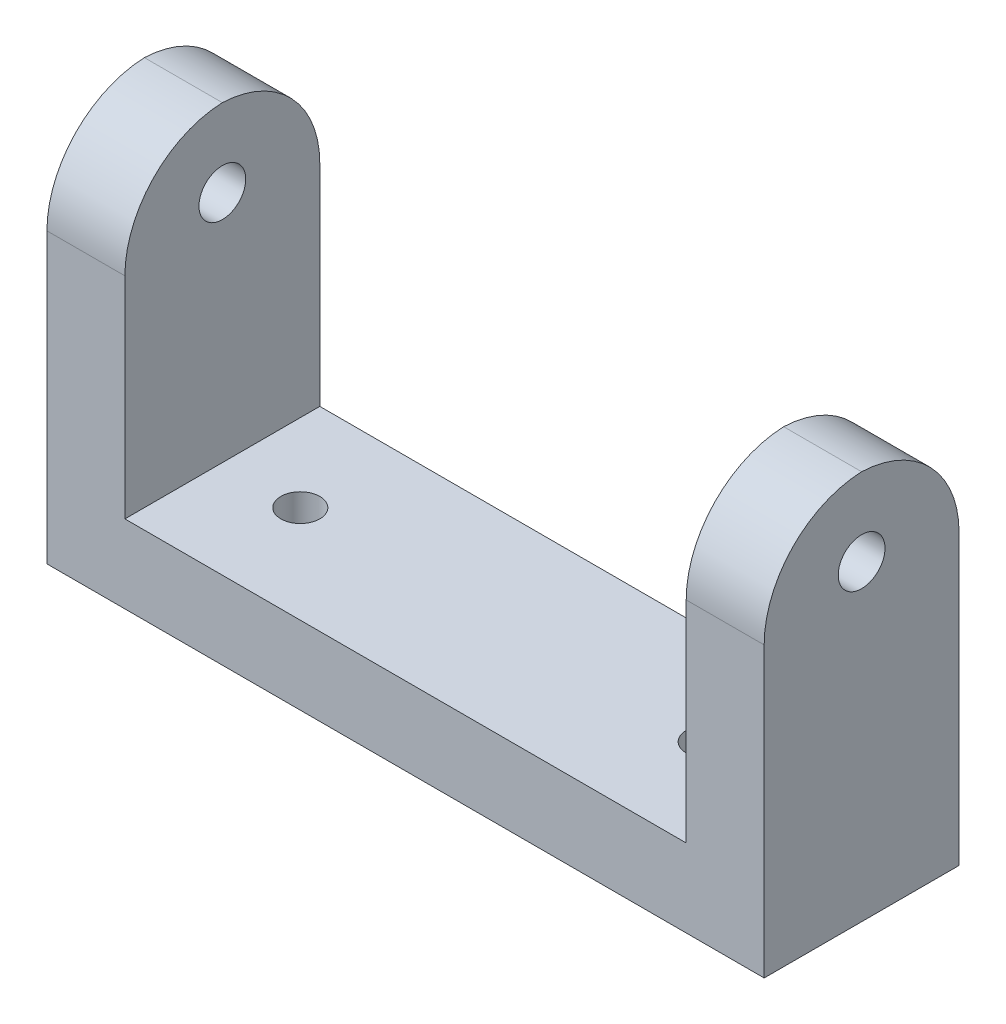
ISO-10303-21;
HEADER;
FILE_DESCRIPTION(('STEP AP214'),'2;1');
FILE_NAME('part.step','',(''),(''),'','','');
FILE_SCHEMA(('AUTOMOTIVE_DESIGN { 1 0 10303 214 1 1 1 1 }'));
ENDSEC;
DATA;
#1=APPLICATION_CONTEXT('core data for automotive mechanical design processes');
#2=APPLICATION_PROTOCOL_DEFINITION('international standard','automotive_design',2000,#1);
#3=PRODUCT_CONTEXT('',#1,'mechanical');
#4=PRODUCT('Part','Part','',(#3));
#5=PRODUCT_RELATED_PRODUCT_CATEGORY('part','',(#4));
#6=PRODUCT_DEFINITION_FORMATION('','',#4);
#7=PRODUCT_DEFINITION_CONTEXT('part definition',#1,'design');
#8=PRODUCT_DEFINITION('design','',#6,#7);
#9=PRODUCT_DEFINITION_SHAPE('','',#8);
#10=(LENGTH_UNIT() NAMED_UNIT(*) SI_UNIT(.MILLI.,.METRE.));
#11=(NAMED_UNIT(*) PLANE_ANGLE_UNIT() SI_UNIT($,.RADIAN.));
#12=(NAMED_UNIT(*) SI_UNIT($,.STERADIAN.) SOLID_ANGLE_UNIT());
#13=UNCERTAINTY_MEASURE_WITH_UNIT(LENGTH_MEASURE(1.E-05),#10,'distance_accuracy_value','');
#14=(GEOMETRIC_REPRESENTATION_CONTEXT(3) GLOBAL_UNCERTAINTY_ASSIGNED_CONTEXT((#13)) GLOBAL_UNIT_ASSIGNED_CONTEXT((#10,
#11,#12)) REPRESENTATION_CONTEXT('',''));
#15=CARTESIAN_POINT('',(0.,0.,0.));
#16=DIRECTION('',(0.,0.,1.));
#17=DIRECTION('',(1.,0.,0.));
#18=AXIS2_PLACEMENT_3D('',#15,#16,#17);
#19=CARTESIAN_POINT('',(0.,0.,25.));
#20=DIRECTION('',(1.,0.,0.));
#21=DIRECTION('',(0.,1.,0.));
#22=AXIS2_PLACEMENT_3D('',#19,#20,#21);
#23=PLANE('',#22);
#24=CARTESIAN_POINT('',(0.,40.,12.5));
#25=DIRECTION('',(1.,0.,0.));
#26=DIRECTION('',(0.,0.,-1.));
#27=AXIS2_PLACEMENT_3D('',#24,#25,#26);
#28=CIRCLE('',#27,3.00000000000001);
#29=CARTESIAN_POINT('',(0.,40.,9.49999999999999));
#30=VERTEX_POINT('',#29);
#31=EDGE_CURVE('E146',#30,#30,#28,.T.);
#32=ORIENTED_EDGE('',*,*,#31,.T.);
#33=EDGE_LOOP('',(#32));
#34=FACE_BOUND('',#33,.T.);
#35=DIRECTION('',(0.,-1.,0.));
#36=VECTOR('',#35,1.);
#37=CARTESIAN_POINT('',(0.,0.,25.));
#38=LINE('',#37,#36);
#39=CARTESIAN_POINT('',(0.,37.,25.));
#40=VERTEX_POINT('',#39);
#41=CARTESIAN_POINT('',(0.,0.,25.));
#42=VERTEX_POINT('',#41);
#43=EDGE_CURVE('E111',#40,#42,#38,.T.);
#44=ORIENTED_EDGE('',*,*,#43,.F.);
#45=CARTESIAN_POINT('',(0.,37.,12.));
#46=DIRECTION('',(1.,0.,0.));
#47=DIRECTION('',(0.,1.,0.));
#48=AXIS2_PLACEMENT_3D('',#45,#46,#47);
#49=CIRCLE('',#48,13.);
#50=CARTESIAN_POINT('',(0.,49.9903810567666,12.5));
#51=VERTEX_POINT('',#50);
#52=EDGE_CURVE('E57',#40,#51,#49,.F.);
#53=ORIENTED_EDGE('',*,*,#52,.T.);
#54=CARTESIAN_POINT('',(0.,37.,13.));
#55=DIRECTION('',(1.,0.,0.));
#56=DIRECTION('',(0.,1.,0.));
#57=AXIS2_PLACEMENT_3D('',#54,#55,#56);
#58=CIRCLE('',#57,13.);
#59=CARTESIAN_POINT('',(0.,37.,0.));
#60=VERTEX_POINT('',#59);
#61=EDGE_CURVE('E161',#51,#60,#58,.F.);
#62=ORIENTED_EDGE('',*,*,#61,.T.);
#63=DIRECTION('',(0.,-1.,0.));
#64=VECTOR('',#63,1.);
#65=CARTESIAN_POINT('',(0.,0.,0.));
#66=LINE('',#65,#64);
#67=CARTESIAN_POINT('',(0.,0.,0.));
#68=VERTEX_POINT('',#67);
#69=EDGE_CURVE('E133',#60,#68,#66,.T.);
#70=ORIENTED_EDGE('',*,*,#69,.T.);
#71=DIRECTION('',(0.,0.,-1.));
#72=VECTOR('',#71,1.);
#73=CARTESIAN_POINT('',(0.,0.,25.));
#74=LINE('',#73,#72);
#75=EDGE_CURVE('E126',#42,#68,#74,.T.);
#76=ORIENTED_EDGE('',*,*,#75,.F.);
#77=EDGE_LOOP('',(#44,#53,#62,#70,#76));
#78=FACE_BOUND('',#77,.T.);
#79=ADVANCED_FACE('F34',(#34,#78),#23,.F.);
#80=CARTESIAN_POINT('',(92.,0.,25.));
#81=DIRECTION('',(0.,1.,0.));
#82=DIRECTION('',(-1.,0.,0.));
#83=AXIS2_PLACEMENT_3D('',#80,#81,#82);
#84=PLANE('',#83);
#85=CARTESIAN_POINT('',(20.,0.,12.5));
#86=DIRECTION('',(0.,1.,0.));
#87=DIRECTION('',(-1.,0.,0.));
#88=AXIS2_PLACEMENT_3D('',#85,#86,#87);
#89=CIRCLE('',#88,2.5);
#90=CARTESIAN_POINT('',(17.5,0.,12.5));
#91=VERTEX_POINT('',#90);
#92=EDGE_CURVE('E223',#91,#91,#89,.T.);
#93=ORIENTED_EDGE('',*,*,#92,.T.);
#94=EDGE_LOOP('',(#93));
#95=FACE_BOUND('',#94,.T.);
#96=CARTESIAN_POINT('',(72.,0.,12.5));
#97=DIRECTION('',(0.,1.,0.));
#98=DIRECTION('',(-1.,0.,0.));
#99=AXIS2_PLACEMENT_3D('',#96,#97,#98);
#100=CIRCLE('',#99,2.49999999999999);
#101=CARTESIAN_POINT('',(69.5,0.,12.5));
#102=VERTEX_POINT('',#101);
#103=EDGE_CURVE('E228',#102,#102,#100,.T.);
#104=ORIENTED_EDGE('',*,*,#103,.T.);
#105=EDGE_LOOP('',(#104));
#106=FACE_BOUND('',#105,.T.);
#107=DIRECTION('',(1.,0.,0.));
#108=VECTOR('',#107,1.);
#109=CARTESIAN_POINT('',(92.,0.,0.));
#110=LINE('',#109,#108);
#111=CARTESIAN_POINT('',(92.,0.,0.));
#112=VERTEX_POINT('',#111);
#113=EDGE_CURVE('E184',#68,#112,#110,.T.);
#114=ORIENTED_EDGE('',*,*,#113,.T.);
#115=DIRECTION('',(0.,0.,-1.));
#116=VECTOR('',#115,1.);
#117=CARTESIAN_POINT('',(92.,0.,25.));
#118=LINE('',#117,#116);
#119=CARTESIAN_POINT('',(92.,0.,25.));
#120=VERTEX_POINT('',#119);
#121=EDGE_CURVE('E128',#120,#112,#118,.T.);
#122=ORIENTED_EDGE('',*,*,#121,.F.);
#123=DIRECTION('',(1.,0.,0.));
#124=VECTOR('',#123,1.);
#125=CARTESIAN_POINT('',(92.,0.,25.));
#126=LINE('',#125,#124);
#127=EDGE_CURVE('E115',#42,#120,#126,.T.);
#128=ORIENTED_EDGE('',*,*,#127,.F.);
#129=ORIENTED_EDGE('',*,*,#75,.T.);
#130=EDGE_LOOP('',(#114,#122,#128,#129));
#131=FACE_BOUND('',#130,.T.);
#132=ADVANCED_FACE('F125',(#95,#106,#131),#84,.F.);
#133=CARTESIAN_POINT('',(92.,50.,25.));
#134=DIRECTION('',(-1.,0.,0.));
#135=DIRECTION('',(0.,0.,1.));
#136=AXIS2_PLACEMENT_3D('',#133,#134,#135);
#137=PLANE('',#136);
#138=CARTESIAN_POINT('',(92.,40.,12.5));
#139=DIRECTION('',(1.,0.,0.));
#140=DIRECTION('',(0.,0.,-1.));
#141=AXIS2_PLACEMENT_3D('',#138,#139,#140);
#142=CIRCLE('',#141,3.00000000000001);
#143=CARTESIAN_POINT('',(92.,40.,9.49999999999999));
#144=VERTEX_POINT('',#143);
#145=EDGE_CURVE('E220',#144,#144,#142,.T.);
#146=ORIENTED_EDGE('',*,*,#145,.F.);
#147=EDGE_LOOP('',(#146));
#148=FACE_BOUND('',#147,.T.);
#149=DIRECTION('',(0.,1.,0.));
#150=VECTOR('',#149,1.);
#151=CARTESIAN_POINT('',(92.,50.,0.));
#152=LINE('',#151,#150);
#153=CARTESIAN_POINT('',(92.,37.,0.));
#154=VERTEX_POINT('',#153);
#155=EDGE_CURVE('E186',#112,#154,#152,.T.);
#156=ORIENTED_EDGE('',*,*,#155,.T.);
#157=CARTESIAN_POINT('',(92.,37.,13.));
#158=DIRECTION('',(-1.,0.,0.));
#159=DIRECTION('',(0.,0.,1.));
#160=AXIS2_PLACEMENT_3D('',#157,#158,#159);
#161=CIRCLE('',#160,13.);
#162=CARTESIAN_POINT('',(92.,49.9903810567666,12.5));
#163=VERTEX_POINT('',#162);
#164=EDGE_CURVE('E156',#154,#163,#161,.F.);
#165=ORIENTED_EDGE('',*,*,#164,.T.);
#166=CARTESIAN_POINT('',(92.,37.,12.));
#167=DIRECTION('',(-1.,0.,0.));
#168=DIRECTION('',(0.,0.,1.));
#169=AXIS2_PLACEMENT_3D('',#166,#167,#168);
#170=CIRCLE('',#169,13.);
#171=CARTESIAN_POINT('',(92.,37.,25.));
#172=VERTEX_POINT('',#171);
#173=EDGE_CURVE('E154',#163,#172,#170,.F.);
#174=ORIENTED_EDGE('',*,*,#173,.T.);
#175=DIRECTION('',(0.,1.,0.));
#176=VECTOR('',#175,1.);
#177=CARTESIAN_POINT('',(92.,50.,25.));
#178=LINE('',#177,#176);
#179=EDGE_CURVE('E130',#120,#172,#178,.T.);
#180=ORIENTED_EDGE('',*,*,#179,.F.);
#181=ORIENTED_EDGE('',*,*,#121,.T.);
#182=EDGE_LOOP('',(#156,#165,#174,#180,#181));
#183=FACE_BOUND('',#182,.T.);
#184=ADVANCED_FACE('F251',(#148,#183),#137,.F.);
#185=CARTESIAN_POINT('',(82.,9.99999999999999,25.));
#186=DIRECTION('',(1.,0.,0.));
#187=DIRECTION('',(0.,0.,-1.));
#188=AXIS2_PLACEMENT_3D('',#185,#186,#187);
#189=PLANE('',#188);
#190=CARTESIAN_POINT('',(82.,40.,12.5));
#191=DIRECTION('',(1.,0.,0.));
#192=DIRECTION('',(0.,0.,-1.));
#193=AXIS2_PLACEMENT_3D('',#190,#191,#192);
#194=CIRCLE('',#193,3.00000000000001);
#195=CARTESIAN_POINT('',(82.,40.,9.49999999999999));
#196=VERTEX_POINT('',#195);
#197=EDGE_CURVE('E145',#196,#196,#194,.T.);
#198=ORIENTED_EDGE('',*,*,#197,.T.);
#199=EDGE_LOOP('',(#198));
#200=FACE_BOUND('',#199,.T.);
#201=CARTESIAN_POINT('',(82.,37.,12.));
#202=DIRECTION('',(1.,0.,0.));
#203=DIRECTION('',(0.,0.,-1.));
#204=AXIS2_PLACEMENT_3D('',#201,#202,#203);
#205=CIRCLE('',#204,13.);
#206=CARTESIAN_POINT('',(82.,37.,25.));
#207=VERTEX_POINT('',#206);
#208=CARTESIAN_POINT('',(82.,49.9903810567666,12.5));
#209=VERTEX_POINT('',#208);
#210=EDGE_CURVE('E135',#207,#209,#205,.F.);
#211=ORIENTED_EDGE('',*,*,#210,.T.);
#212=CARTESIAN_POINT('',(82.,37.,13.));
#213=DIRECTION('',(1.,0.,0.));
#214=DIRECTION('',(0.,0.,-1.));
#215=AXIS2_PLACEMENT_3D('',#212,#213,#214);
#216=CIRCLE('',#215,13.);
#217=CARTESIAN_POINT('',(82.,37.,0.));
#218=VERTEX_POINT('',#217);
#219=EDGE_CURVE('E137',#209,#218,#216,.F.);
#220=ORIENTED_EDGE('',*,*,#219,.T.);
#221=DIRECTION('',(0.,-1.,0.));
#222=VECTOR('',#221,1.);
#223=CARTESIAN_POINT('',(82.,9.99999999999999,0.));
#224=LINE('',#223,#222);
#225=CARTESIAN_POINT('',(82.,9.99999999999999,0.));
#226=VERTEX_POINT('',#225);
#227=EDGE_CURVE('E196',#218,#226,#224,.T.);
#228=ORIENTED_EDGE('',*,*,#227,.T.);
#229=DIRECTION('',(0.,0.,-1.));
#230=VECTOR('',#229,1.);
#231=CARTESIAN_POINT('',(82.,9.99999999999999,25.));
#232=LINE('',#231,#230);
#233=CARTESIAN_POINT('',(82.,9.99999999999999,25.));
#234=VERTEX_POINT('',#233);
#235=EDGE_CURVE('E139',#234,#226,#232,.T.);
#236=ORIENTED_EDGE('',*,*,#235,.F.);
#237=DIRECTION('',(0.,-1.,0.));
#238=VECTOR('',#237,1.);
#239=CARTESIAN_POINT('',(82.,9.99999999999999,25.));
#240=LINE('',#239,#238);
#241=EDGE_CURVE('E216',#207,#234,#240,.T.);
#242=ORIENTED_EDGE('',*,*,#241,.F.);
#243=EDGE_LOOP('',(#211,#220,#228,#236,#242));
#244=FACE_BOUND('',#243,.T.);
#245=ADVANCED_FACE('F239',(#200,#244),#189,.F.);
#246=CARTESIAN_POINT('',(10.,9.99999999999999,25.));
#247=DIRECTION('',(0.,-1.,0.));
#248=DIRECTION('',(0.,0.,-1.));
#249=AXIS2_PLACEMENT_3D('',#246,#247,#248);
#250=PLANE('',#249);
#251=CARTESIAN_POINT('',(20.,9.99999999999999,12.5));
#252=DIRECTION('',(0.,1.,0.));
#253=DIRECTION('',(0.,0.,1.));
#254=AXIS2_PLACEMENT_3D('',#251,#252,#253);
#255=CIRCLE('',#254,2.5);
#256=CARTESIAN_POINT('',(20.,9.99999999999999,15.));
#257=VERTEX_POINT('',#256);
#258=EDGE_CURVE('E171',#257,#257,#255,.T.);
#259=ORIENTED_EDGE('',*,*,#258,.F.);
#260=EDGE_LOOP('',(#259));
#261=FACE_BOUND('',#260,.T.);
#262=CARTESIAN_POINT('',(72.,9.99999999999999,12.5));
#263=DIRECTION('',(0.,1.,0.));
#264=DIRECTION('',(0.,0.,1.));
#265=AXIS2_PLACEMENT_3D('',#262,#263,#264);
#266=CIRCLE('',#265,2.49999999999999);
#267=CARTESIAN_POINT('',(72.,9.99999999999999,15.));
#268=VERTEX_POINT('',#267);
#269=EDGE_CURVE('E166',#268,#268,#266,.T.);
#270=ORIENTED_EDGE('',*,*,#269,.F.);
#271=EDGE_LOOP('',(#270));
#272=FACE_BOUND('',#271,.T.);
#273=DIRECTION('',(-1.,0.,0.));
#274=VECTOR('',#273,1.);
#275=CARTESIAN_POINT('',(10.,9.99999999999999,0.));
#276=LINE('',#275,#274);
#277=CARTESIAN_POINT('',(10.,9.99999999999999,0.));
#278=VERTEX_POINT('',#277);
#279=EDGE_CURVE('E198',#226,#278,#276,.T.);
#280=ORIENTED_EDGE('',*,*,#279,.T.);
#281=DIRECTION('',(0.,0.,-1.));
#282=VECTOR('',#281,1.);
#283=CARTESIAN_POINT('',(10.,9.99999999999999,25.));
#284=LINE('',#283,#282);
#285=CARTESIAN_POINT('',(10.,9.99999999999999,25.));
#286=VERTEX_POINT('',#285);
#287=EDGE_CURVE('E201',#286,#278,#284,.T.);
#288=ORIENTED_EDGE('',*,*,#287,.F.);
#289=DIRECTION('',(-1.,0.,0.));
#290=VECTOR('',#289,1.);
#291=CARTESIAN_POINT('',(10.,9.99999999999999,25.));
#292=LINE('',#291,#290);
#293=EDGE_CURVE('E210',#234,#286,#292,.T.);
#294=ORIENTED_EDGE('',*,*,#293,.F.);
#295=ORIENTED_EDGE('',*,*,#235,.T.);
#296=EDGE_LOOP('',(#280,#288,#294,#295));
#297=FACE_BOUND('',#296,.T.);
#298=ADVANCED_FACE('F208',(#261,#272,#297),#250,.F.);
#299=CARTESIAN_POINT('',(9.99999999999999,50.,25.));
#300=DIRECTION('',(-1.,0.,0.));
#301=DIRECTION('',(0.,-1.,0.));
#302=AXIS2_PLACEMENT_3D('',#299,#300,#301);
#303=PLANE('',#302);
#304=CARTESIAN_POINT('',(9.99999999999999,40.,12.5));
#305=DIRECTION('',(-1.,0.,0.));
#306=DIRECTION('',(0.,-1.,0.));
#307=AXIS2_PLACEMENT_3D('',#304,#305,#306);
#308=CIRCLE('',#307,3.00000000000001);
#309=CARTESIAN_POINT('',(9.99999999999999,37.,12.5));
#310=VERTEX_POINT('',#309);
#311=EDGE_CURVE('E143',#310,#310,#308,.T.);
#312=ORIENTED_EDGE('',*,*,#311,.T.);
#313=EDGE_LOOP('',(#312));
#314=FACE_BOUND('',#313,.T.);
#315=CARTESIAN_POINT('',(9.99999999999999,37.,13.));
#316=DIRECTION('',(-1.,0.,0.));
#317=DIRECTION('',(0.,-1.,0.));
#318=AXIS2_PLACEMENT_3D('',#315,#316,#317);
#319=CIRCLE('',#318,13.);
#320=CARTESIAN_POINT('',(9.99999999999999,37.,0.));
#321=VERTEX_POINT('',#320);
#322=CARTESIAN_POINT('',(9.99999999999999,49.9903810567666,12.5));
#323=VERTEX_POINT('',#322);
#324=EDGE_CURVE('E43',#321,#323,#319,.F.);
#325=ORIENTED_EDGE('',*,*,#324,.T.);
#326=CARTESIAN_POINT('',(9.99999999999999,37.,12.));
#327=DIRECTION('',(-1.,0.,0.));
#328=DIRECTION('',(0.,-1.,0.));
#329=AXIS2_PLACEMENT_3D('',#326,#327,#328);
#330=CIRCLE('',#329,13.);
#331=CARTESIAN_POINT('',(9.99999999999999,37.,25.));
#332=VERTEX_POINT('',#331);
#333=EDGE_CURVE('E11',#323,#332,#330,.F.);
#334=ORIENTED_EDGE('',*,*,#333,.T.);
#335=DIRECTION('',(0.,1.,0.));
#336=VECTOR('',#335,1.);
#337=CARTESIAN_POINT('',(9.99999999999999,50.,25.));
#338=LINE('',#337,#336);
#339=EDGE_CURVE('E191',#286,#332,#338,.T.);
#340=ORIENTED_EDGE('',*,*,#339,.F.);
#341=ORIENTED_EDGE('',*,*,#287,.T.);
#342=DIRECTION('',(0.,1.,0.));
#343=VECTOR('',#342,1.);
#344=CARTESIAN_POINT('',(9.99999999999999,50.,0.));
#345=LINE('',#344,#343);
#346=EDGE_CURVE('E121',#278,#321,#345,.T.);
#347=ORIENTED_EDGE('',*,*,#346,.T.);
#348=EDGE_LOOP('',(#325,#334,#340,#341,#347));
#349=FACE_BOUND('',#348,.T.);
#350=ADVANCED_FACE('F214',(#314,#349),#303,.F.);
#351=CARTESIAN_POINT('',(0.,0.,25.));
#352=DIRECTION('',(0.,0.,-1.));
#353=DIRECTION('',(-1.,0.,0.));
#354=AXIS2_PLACEMENT_3D('',#351,#352,#353);
#355=PLANE('',#354);
#356=ORIENTED_EDGE('',*,*,#179,.T.);
#357=DIRECTION('',(-1.,0.,0.));
#358=VECTOR('',#357,1.);
#359=CARTESIAN_POINT('',(0.,36.9999999999999,25.));
#360=LINE('',#359,#358);
#361=EDGE_CURVE('E159',#172,#207,#360,.T.);
#362=ORIENTED_EDGE('',*,*,#361,.T.);
#363=ORIENTED_EDGE('',*,*,#241,.T.);
#364=ORIENTED_EDGE('',*,*,#293,.T.);
#365=ORIENTED_EDGE('',*,*,#339,.T.);
#366=DIRECTION('',(-1.,0.,0.));
#367=VECTOR('',#366,1.);
#368=CARTESIAN_POINT('',(0.,37.,25.));
#369=LINE('',#368,#367);
#370=EDGE_CURVE('E119',#332,#40,#369,.T.);
#371=ORIENTED_EDGE('',*,*,#370,.T.);
#372=ORIENTED_EDGE('',*,*,#43,.T.);
#373=ORIENTED_EDGE('',*,*,#127,.T.);
#374=EDGE_LOOP('',(#356,#362,#363,#364,#365,#371,#372,#373));
#375=FACE_BOUND('',#374,.T.);
#376=ADVANCED_FACE('F114',(#375),#355,.F.);
#377=CARTESIAN_POINT('',(0.,0.,0.));
#378=DIRECTION('',(0.,0.,-1.));
#379=DIRECTION('',(-1.,0.,0.));
#380=AXIS2_PLACEMENT_3D('',#377,#378,#379);
#381=PLANE('',#380);
#382=ORIENTED_EDGE('',*,*,#227,.F.);
#383=DIRECTION('',(-1.,0.,0.));
#384=VECTOR('',#383,1.);
#385=CARTESIAN_POINT('',(92.,37.,0.));
#386=LINE('',#385,#384);
#387=EDGE_CURVE('E151',#218,#154,#386,.F.);
#388=ORIENTED_EDGE('',*,*,#387,.T.);
#389=ORIENTED_EDGE('',*,*,#155,.F.);
#390=ORIENTED_EDGE('',*,*,#113,.F.);
#391=ORIENTED_EDGE('',*,*,#69,.F.);
#392=DIRECTION('',(-1.,0.,0.));
#393=VECTOR('',#392,1.);
#394=CARTESIAN_POINT('',(9.99999999999999,37.,0.));
#395=LINE('',#394,#393);
#396=EDGE_CURVE('E149',#60,#321,#395,.F.);
#397=ORIENTED_EDGE('',*,*,#396,.T.);
#398=ORIENTED_EDGE('',*,*,#346,.F.);
#399=ORIENTED_EDGE('',*,*,#279,.F.);
#400=EDGE_LOOP('',(#382,#388,#389,#390,#391,#397,#398,#399));
#401=FACE_BOUND('',#400,.T.);
#402=ADVANCED_FACE('F181',(#401),#381,.T.);
#403=CARTESIAN_POINT('',(0.,40.,12.5));
#404=DIRECTION('',(1.,0.,0.));
#405=DIRECTION('',(0.,0.,-1.));
#406=AXIS2_PLACEMENT_3D('',#403,#404,#405);
#407=CYLINDRICAL_SURFACE('',#406,3.00000000000001);
#408=ORIENTED_EDGE('',*,*,#31,.F.);
#409=EDGE_LOOP('',(#408));
#410=FACE_BOUND('',#409,.T.);
#411=ORIENTED_EDGE('',*,*,#311,.F.);
#412=EDGE_LOOP('',(#411));
#413=FACE_BOUND('',#412,.T.);
#414=ADVANCED_FACE('F303',(#410,#413),#407,.F.);
#415=ORIENTED_EDGE('',*,*,#145,.T.);
#416=EDGE_LOOP('',(#415));
#417=FACE_BOUND('',#416,.T.);
#418=ORIENTED_EDGE('',*,*,#197,.F.);
#419=EDGE_LOOP('',(#418));
#420=FACE_BOUND('',#419,.T.);
#421=ADVANCED_FACE('F246',(#417,#420),#407,.F.);
#422=CARTESIAN_POINT('',(72.,-10.,12.5));
#423=DIRECTION('',(0.,1.,0.));
#424=DIRECTION('',(0.,0.,1.));
#425=AXIS2_PLACEMENT_3D('',#422,#423,#424);
#426=CYLINDRICAL_SURFACE('',#425,2.49999999999999);
#427=ORIENTED_EDGE('',*,*,#269,.T.);
#428=EDGE_LOOP('',(#427));
#429=FACE_BOUND('',#428,.T.);
#430=ORIENTED_EDGE('',*,*,#103,.F.);
#431=EDGE_LOOP('',(#430));
#432=FACE_BOUND('',#431,.T.);
#433=ADVANCED_FACE('F243',(#429,#432),#426,.F.);
#434=CARTESIAN_POINT('',(20.,-10.,12.5));
#435=DIRECTION('',(0.,1.,0.));
#436=DIRECTION('',(0.,0.,1.));
#437=AXIS2_PLACEMENT_3D('',#434,#435,#436);
#438=CYLINDRICAL_SURFACE('',#437,2.5);
#439=ORIENTED_EDGE('',*,*,#258,.T.);
#440=EDGE_LOOP('',(#439));
#441=FACE_BOUND('',#440,.T.);
#442=ORIENTED_EDGE('',*,*,#92,.F.);
#443=EDGE_LOOP('',(#442));
#444=FACE_BOUND('',#443,.T.);
#445=ADVANCED_FACE('F234',(#441,#444),#438,.F.);
#446=CARTESIAN_POINT('',(0.,36.9999999999999,12.));
#447=DIRECTION('',(-1.,0.,0.));
#448=DIRECTION('',(0.,-1.,0.));
#449=AXIS2_PLACEMENT_3D('',#446,#447,#448);
#450=CYLINDRICAL_SURFACE('',#449,13.);
#451=ORIENTED_EDGE('',*,*,#361,.F.);
#452=ORIENTED_EDGE('',*,*,#173,.F.);
#453=DIRECTION('',(-1.,0.,0.));
#454=VECTOR('',#453,1.);
#455=CARTESIAN_POINT('',(87.,49.9903810567666,12.5000000000001));
#456=LINE('',#455,#454);
#457=EDGE_CURVE('E164',#209,#163,#456,.F.);
#458=ORIENTED_EDGE('',*,*,#457,.F.);
#459=ORIENTED_EDGE('',*,*,#210,.F.);
#460=EDGE_LOOP('',(#451,#452,#458,#459));
#461=FACE_BOUND('',#460,.T.);
#462=ADVANCED_FACE('F267',(#461),#450,.T.);
#463=CARTESIAN_POINT('',(82.,37.,13.));
#464=DIRECTION('',(1.,0.,0.));
#465=DIRECTION('',(0.,1.,0.));
#466=AXIS2_PLACEMENT_3D('',#463,#464,#465);
#467=CYLINDRICAL_SURFACE('',#466,13.);
#468=ORIENTED_EDGE('',*,*,#164,.F.);
#469=ORIENTED_EDGE('',*,*,#387,.F.);
#470=ORIENTED_EDGE('',*,*,#219,.F.);
#471=ORIENTED_EDGE('',*,*,#457,.T.);
#472=EDGE_LOOP('',(#468,#469,#470,#471));
#473=FACE_BOUND('',#472,.T.);
#474=ADVANCED_FACE('F264',(#473),#467,.T.);
#475=CARTESIAN_POINT('',(0.,37.,13.));
#476=DIRECTION('',(1.,0.,0.));
#477=DIRECTION('',(0.,0.,-1.));
#478=AXIS2_PLACEMENT_3D('',#475,#476,#477);
#479=CYLINDRICAL_SURFACE('',#478,13.);
#480=DIRECTION('',(1.,0.,0.));
#481=VECTOR('',#480,1.);
#482=CARTESIAN_POINT('',(4.99999999999999,49.9903810567666,12.5));
#483=LINE('',#482,#481);
#484=EDGE_CURVE('E38',#323,#51,#483,.F.);
#485=ORIENTED_EDGE('',*,*,#484,.F.);
#486=ORIENTED_EDGE('',*,*,#324,.F.);
#487=ORIENTED_EDGE('',*,*,#396,.F.);
#488=ORIENTED_EDGE('',*,*,#61,.F.);
#489=EDGE_LOOP('',(#485,#486,#487,#488));
#490=FACE_BOUND('',#489,.T.);
#491=ADVANCED_FACE('F36',(#490),#479,.T.);
#492=CARTESIAN_POINT('',(0.,37.,12.));
#493=DIRECTION('',(-1.,0.,0.));
#494=DIRECTION('',(0.,0.,1.));
#495=AXIS2_PLACEMENT_3D('',#492,#493,#494);
#496=CYLINDRICAL_SURFACE('',#495,13.);
#497=ORIENTED_EDGE('',*,*,#333,.F.);
#498=ORIENTED_EDGE('',*,*,#484,.T.);
#499=ORIENTED_EDGE('',*,*,#52,.F.);
#500=ORIENTED_EDGE('',*,*,#370,.F.);
#501=EDGE_LOOP('',(#497,#498,#499,#500));
#502=FACE_BOUND('',#501,.T.);
#503=ADVANCED_FACE('F176',(#502),#496,.T.);
#504=CLOSED_SHELL('',(#79,#132,#184,#245,#298,#350,#376,#402,#414,#421,#433,#445,#462,#474,#491,#503));
#505=MANIFOLD_SOLID_BREP('B2',#504);
#506=ADVANCED_BREP_SHAPE_REPRESENTATION('',(#18,#505),#14);
#507=SHAPE_DEFINITION_REPRESENTATION(#9,#506);
ENDSEC;
END-ISO-10303-21;
